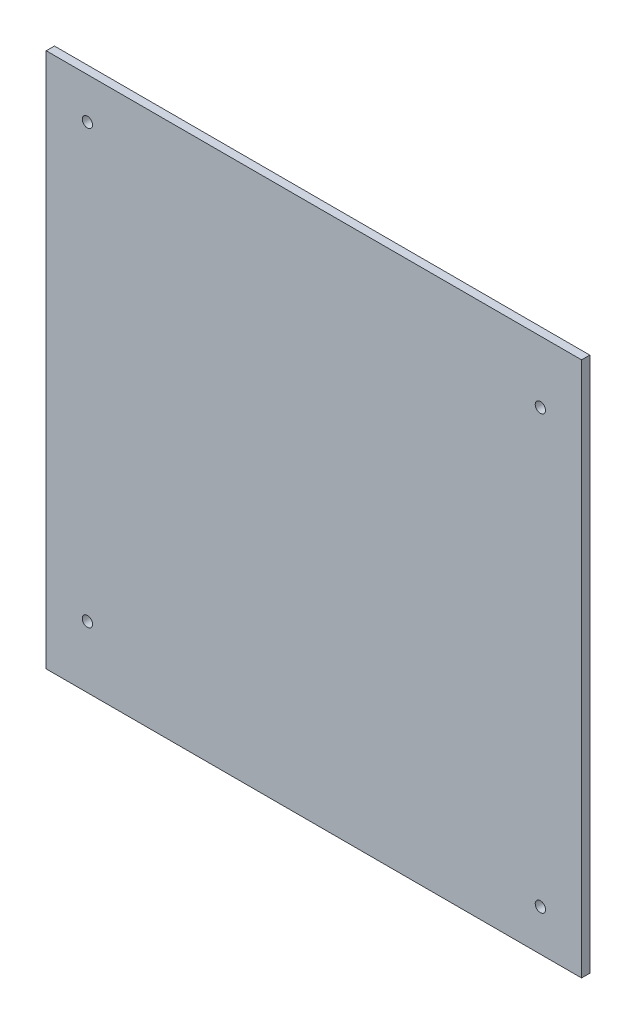
ISO-10303-21;
HEADER;
FILE_DESCRIPTION(('STEP AP214'),'2;1');
FILE_NAME('part.step','',(''),(''),'','','');
FILE_SCHEMA(('AUTOMOTIVE_DESIGN { 1 0 10303 214 1 1 1 1 }'));
ENDSEC;
DATA;
#1=APPLICATION_CONTEXT('core data for automotive mechanical design processes');
#2=APPLICATION_PROTOCOL_DEFINITION('international standard','automotive_design',2000,#1);
#3=PRODUCT_CONTEXT('',#1,'mechanical');
#4=PRODUCT('Part','Part','',(#3));
#5=PRODUCT_RELATED_PRODUCT_CATEGORY('part','',(#4));
#6=PRODUCT_DEFINITION_FORMATION('','',#4);
#7=PRODUCT_DEFINITION_CONTEXT('part definition',#1,'design');
#8=PRODUCT_DEFINITION('design','',#6,#7);
#9=PRODUCT_DEFINITION_SHAPE('','',#8);
#10=(LENGTH_UNIT() NAMED_UNIT(*) SI_UNIT(.MILLI.,.METRE.));
#11=(NAMED_UNIT(*) PLANE_ANGLE_UNIT() SI_UNIT($,.RADIAN.));
#12=(NAMED_UNIT(*) SI_UNIT($,.STERADIAN.) SOLID_ANGLE_UNIT());
#13=UNCERTAINTY_MEASURE_WITH_UNIT(LENGTH_MEASURE(1.E-05),#10,'distance_accuracy_value','');
#14=(GEOMETRIC_REPRESENTATION_CONTEXT(3) GLOBAL_UNCERTAINTY_ASSIGNED_CONTEXT((#13)) GLOBAL_UNIT_ASSIGNED_CONTEXT((#10,
#11,#12)) REPRESENTATION_CONTEXT('',''));
#15=CARTESIAN_POINT('',(0.,0.,0.));
#16=DIRECTION('',(0.,0.,1.));
#17=DIRECTION('',(1.,0.,0.));
#18=AXIS2_PLACEMENT_3D('',#15,#16,#17);
#19=CARTESIAN_POINT('',(0.,0.,2.));
#20=DIRECTION('',(0.,0.,-1.));
#21=DIRECTION('',(-1.,0.,0.));
#22=AXIS2_PLACEMENT_3D('',#19,#20,#21);
#23=PLANE('',#22);
#24=DIRECTION('',(0.,1.,0.));
#25=VECTOR('',#24,1.);
#26=CARTESIAN_POINT('',(65.,-65.,2.));
#27=LINE('',#26,#25);
#28=CARTESIAN_POINT('',(65.,-65.,2.));
#29=VERTEX_POINT('',#28);
#30=CARTESIAN_POINT('',(65.,65.,2.));
#31=VERTEX_POINT('',#30);
#32=EDGE_CURVE('E86',#29,#31,#27,.T.);
#33=ORIENTED_EDGE('',*,*,#32,.T.);
#34=DIRECTION('',(-1.,0.,0.));
#35=VECTOR('',#34,1.);
#36=CARTESIAN_POINT('',(-65.,65.,2.));
#37=LINE('',#36,#35);
#38=CARTESIAN_POINT('',(-65.,65.,2.));
#39=VERTEX_POINT('',#38);
#40=EDGE_CURVE('E81',#31,#39,#37,.T.);
#41=ORIENTED_EDGE('',*,*,#40,.T.);
#42=DIRECTION('',(0.,-1.,0.));
#43=VECTOR('',#42,1.);
#44=CARTESIAN_POINT('',(-65.,-65.,2.));
#45=LINE('',#44,#43);
#46=CARTESIAN_POINT('',(-65.,-65.,2.));
#47=VERTEX_POINT('',#46);
#48=EDGE_CURVE('E84',#39,#47,#45,.T.);
#49=ORIENTED_EDGE('',*,*,#48,.T.);
#50=DIRECTION('',(1.,0.,0.));
#51=VECTOR('',#50,1.);
#52=CARTESIAN_POINT('',(-65.,-65.,2.));
#53=LINE('',#52,#51);
#54=EDGE_CURVE('E51',#47,#29,#53,.T.);
#55=ORIENTED_EDGE('',*,*,#54,.T.);
#56=EDGE_LOOP('',(#33,#41,#49,#55));
#57=FACE_BOUND('',#56,.T.);
#58=CARTESIAN_POINT('',(-55.,55.,2.));
#59=DIRECTION('',(0.,0.,1.));
#60=DIRECTION('',(1.,0.,0.));
#61=AXIS2_PLACEMENT_3D('',#58,#59,#60);
#62=CIRCLE('',#61,1.25);
#63=CARTESIAN_POINT('',(-53.75,55.,2.));
#64=VERTEX_POINT('',#63);
#65=EDGE_CURVE('E101',#64,#64,#62,.T.);
#66=ORIENTED_EDGE('',*,*,#65,.F.);
#67=EDGE_LOOP('',(#66));
#68=FACE_BOUND('',#67,.T.);
#69=CARTESIAN_POINT('',(55.,50.,2.));
#70=DIRECTION('',(0.,0.,1.));
#71=DIRECTION('',(1.,0.,0.));
#72=AXIS2_PLACEMENT_3D('',#69,#70,#71);
#73=CIRCLE('',#72,1.25);
#74=CARTESIAN_POINT('',(56.25,50.,2.));
#75=VERTEX_POINT('',#74);
#76=EDGE_CURVE('E116',#75,#75,#73,.T.);
#77=ORIENTED_EDGE('',*,*,#76,.F.);
#78=EDGE_LOOP('',(#77));
#79=FACE_BOUND('',#78,.T.);
#80=CARTESIAN_POINT('',(55.,-55.,2.));
#81=DIRECTION('',(0.,0.,1.));
#82=DIRECTION('',(1.,0.,0.));
#83=AXIS2_PLACEMENT_3D('',#80,#81,#82);
#84=CIRCLE('',#83,1.25);
#85=CARTESIAN_POINT('',(56.25,-55.,2.));
#86=VERTEX_POINT('',#85);
#87=EDGE_CURVE('E122',#86,#86,#84,.T.);
#88=ORIENTED_EDGE('',*,*,#87,.F.);
#89=EDGE_LOOP('',(#88));
#90=FACE_BOUND('',#89,.T.);
#91=CARTESIAN_POINT('',(-55.,-50.,2.));
#92=DIRECTION('',(0.,0.,1.));
#93=DIRECTION('',(1.,0.,0.));
#94=AXIS2_PLACEMENT_3D('',#91,#92,#93);
#95=CIRCLE('',#94,1.25);
#96=CARTESIAN_POINT('',(-53.75,-50.,2.));
#97=VERTEX_POINT('',#96);
#98=EDGE_CURVE('E128',#97,#97,#95,.T.);
#99=ORIENTED_EDGE('',*,*,#98,.F.);
#100=EDGE_LOOP('',(#99));
#101=FACE_BOUND('',#100,.T.);
#102=ADVANCED_FACE('F34',(#57,#68,#79,#90,#101),#23,.F.);
#103=CARTESIAN_POINT('',(0.,0.,0.));
#104=DIRECTION('',(0.,0.,-1.));
#105=DIRECTION('',(-1.,0.,0.));
#106=AXIS2_PLACEMENT_3D('',#103,#104,#105);
#107=PLANE('',#106);
#108=CARTESIAN_POINT('',(55.,-55.,0.));
#109=DIRECTION('',(0.,0.,1.));
#110=DIRECTION('',(1.,0.,0.));
#111=AXIS2_PLACEMENT_3D('',#108,#109,#110);
#112=CIRCLE('',#111,1.25);
#113=CARTESIAN_POINT('',(56.25,-55.,0.));
#114=VERTEX_POINT('',#113);
#115=EDGE_CURVE('E125',#114,#114,#112,.T.);
#116=ORIENTED_EDGE('',*,*,#115,.T.);
#117=EDGE_LOOP('',(#116));
#118=FACE_BOUND('',#117,.T.);
#119=CARTESIAN_POINT('',(-55.,55.,0.));
#120=DIRECTION('',(0.,0.,1.));
#121=DIRECTION('',(1.,0.,0.));
#122=AXIS2_PLACEMENT_3D('',#119,#120,#121);
#123=CIRCLE('',#122,1.25);
#124=CARTESIAN_POINT('',(-53.75,55.,0.));
#125=VERTEX_POINT('',#124);
#126=EDGE_CURVE('E113',#125,#125,#123,.T.);
#127=ORIENTED_EDGE('',*,*,#126,.T.);
#128=EDGE_LOOP('',(#127));
#129=FACE_BOUND('',#128,.T.);
#130=DIRECTION('',(0.,1.,0.));
#131=VECTOR('',#130,1.);
#132=CARTESIAN_POINT('',(65.,-65.,0.));
#133=LINE('',#132,#131);
#134=CARTESIAN_POINT('',(65.,-65.,0.));
#135=VERTEX_POINT('',#134);
#136=CARTESIAN_POINT('',(65.,65.,0.));
#137=VERTEX_POINT('',#136);
#138=EDGE_CURVE('E98',#135,#137,#133,.T.);
#139=ORIENTED_EDGE('',*,*,#138,.F.);
#140=DIRECTION('',(1.,0.,0.));
#141=VECTOR('',#140,1.);
#142=CARTESIAN_POINT('',(-65.,-65.,0.));
#143=LINE('',#142,#141);
#144=CARTESIAN_POINT('',(-65.,-65.,0.));
#145=VERTEX_POINT('',#144);
#146=EDGE_CURVE('E74',#145,#135,#143,.T.);
#147=ORIENTED_EDGE('',*,*,#146,.F.);
#148=DIRECTION('',(0.,-1.,0.));
#149=VECTOR('',#148,1.);
#150=CARTESIAN_POINT('',(-65.,-65.,0.));
#151=LINE('',#150,#149);
#152=CARTESIAN_POINT('',(-65.,65.,0.));
#153=VERTEX_POINT('',#152);
#154=EDGE_CURVE('E68',#153,#145,#151,.T.);
#155=ORIENTED_EDGE('',*,*,#154,.F.);
#156=DIRECTION('',(-1.,0.,0.));
#157=VECTOR('',#156,1.);
#158=CARTESIAN_POINT('',(-65.,65.,0.));
#159=LINE('',#158,#157);
#160=EDGE_CURVE('E90',#137,#153,#159,.T.);
#161=ORIENTED_EDGE('',*,*,#160,.F.);
#162=EDGE_LOOP('',(#139,#147,#155,#161));
#163=FACE_BOUND('',#162,.T.);
#164=CARTESIAN_POINT('',(55.,50.,0.));
#165=DIRECTION('',(0.,0.,1.));
#166=DIRECTION('',(1.,0.,0.));
#167=AXIS2_PLACEMENT_3D('',#164,#165,#166);
#168=CIRCLE('',#167,1.25);
#169=CARTESIAN_POINT('',(56.25,50.,0.));
#170=VERTEX_POINT('',#169);
#171=EDGE_CURVE('E119',#170,#170,#168,.T.);
#172=ORIENTED_EDGE('',*,*,#171,.T.);
#173=EDGE_LOOP('',(#172));
#174=FACE_BOUND('',#173,.T.);
#175=CARTESIAN_POINT('',(-55.,-50.,0.));
#176=DIRECTION('',(0.,0.,1.));
#177=DIRECTION('',(1.,0.,0.));
#178=AXIS2_PLACEMENT_3D('',#175,#176,#177);
#179=CIRCLE('',#178,1.25);
#180=CARTESIAN_POINT('',(-53.75,-50.,0.));
#181=VERTEX_POINT('',#180);
#182=EDGE_CURVE('E131',#181,#181,#179,.T.);
#183=ORIENTED_EDGE('',*,*,#182,.T.);
#184=EDGE_LOOP('',(#183));
#185=FACE_BOUND('',#184,.T.);
#186=ADVANCED_FACE('F109',(#118,#129,#163,#174,#185),#107,.T.);
#187=CARTESIAN_POINT('',(65.,-65.,2.));
#188=DIRECTION('',(-1.,0.,0.));
#189=DIRECTION('',(0.,0.,1.));
#190=AXIS2_PLACEMENT_3D('',#187,#188,#189);
#191=PLANE('',#190);
#192=ORIENTED_EDGE('',*,*,#138,.T.);
#193=DIRECTION('',(0.,0.,-1.));
#194=VECTOR('',#193,1.);
#195=CARTESIAN_POINT('',(65.,65.,2.));
#196=LINE('',#195,#194);
#197=EDGE_CURVE('E11',#31,#137,#196,.T.);
#198=ORIENTED_EDGE('',*,*,#197,.F.);
#199=ORIENTED_EDGE('',*,*,#32,.F.);
#200=DIRECTION('',(0.,0.,-1.));
#201=VECTOR('',#200,1.);
#202=CARTESIAN_POINT('',(65.,-65.,2.));
#203=LINE('',#202,#201);
#204=EDGE_CURVE('E94',#29,#135,#203,.T.);
#205=ORIENTED_EDGE('',*,*,#204,.T.);
#206=EDGE_LOOP('',(#192,#198,#199,#205));
#207=FACE_BOUND('',#206,.T.);
#208=ADVANCED_FACE('F36',(#207),#191,.F.);
#209=CARTESIAN_POINT('',(-65.,65.,2.));
#210=DIRECTION('',(0.,-1.,0.));
#211=DIRECTION('',(0.,0.,-1.));
#212=AXIS2_PLACEMENT_3D('',#209,#210,#211);
#213=PLANE('',#212);
#214=ORIENTED_EDGE('',*,*,#160,.T.);
#215=DIRECTION('',(0.,0.,-1.));
#216=VECTOR('',#215,1.);
#217=CARTESIAN_POINT('',(-65.,65.,2.));
#218=LINE('',#217,#216);
#219=EDGE_CURVE('E43',#39,#153,#218,.T.);
#220=ORIENTED_EDGE('',*,*,#219,.F.);
#221=ORIENTED_EDGE('',*,*,#40,.F.);
#222=ORIENTED_EDGE('',*,*,#197,.T.);
#223=EDGE_LOOP('',(#214,#220,#221,#222));
#224=FACE_BOUND('',#223,.T.);
#225=ADVANCED_FACE('F89',(#224),#213,.F.);
#226=CARTESIAN_POINT('',(-65.,-65.,2.));
#227=DIRECTION('',(1.,0.,0.));
#228=DIRECTION('',(0.,0.,-1.));
#229=AXIS2_PLACEMENT_3D('',#226,#227,#228);
#230=PLANE('',#229);
#231=ORIENTED_EDGE('',*,*,#154,.T.);
#232=DIRECTION('',(0.,0.,-1.));
#233=VECTOR('',#232,1.);
#234=CARTESIAN_POINT('',(-65.,-65.,2.));
#235=LINE('',#234,#233);
#236=EDGE_CURVE('E91',#47,#145,#235,.T.);
#237=ORIENTED_EDGE('',*,*,#236,.F.);
#238=ORIENTED_EDGE('',*,*,#48,.F.);
#239=ORIENTED_EDGE('',*,*,#219,.T.);
#240=EDGE_LOOP('',(#231,#237,#238,#239));
#241=FACE_BOUND('',#240,.T.);
#242=ADVANCED_FACE('F92',(#241),#230,.F.);
#243=CARTESIAN_POINT('',(-65.,-65.,2.));
#244=DIRECTION('',(0.,1.,0.));
#245=DIRECTION('',(0.,0.,1.));
#246=AXIS2_PLACEMENT_3D('',#243,#244,#245);
#247=PLANE('',#246);
#248=ORIENTED_EDGE('',*,*,#146,.T.);
#249=ORIENTED_EDGE('',*,*,#204,.F.);
#250=ORIENTED_EDGE('',*,*,#54,.F.);
#251=ORIENTED_EDGE('',*,*,#236,.T.);
#252=EDGE_LOOP('',(#248,#249,#250,#251));
#253=FACE_BOUND('',#252,.T.);
#254=ADVANCED_FACE('F106',(#253),#247,.F.);
#255=CARTESIAN_POINT('',(-55.,55.,2.));
#256=DIRECTION('',(0.,0.,-1.));
#257=DIRECTION('',(-1.,0.,0.));
#258=AXIS2_PLACEMENT_3D('',#255,#256,#257);
#259=CYLINDRICAL_SURFACE('',#258,1.25);
#260=ORIENTED_EDGE('',*,*,#65,.T.);
#261=EDGE_LOOP('',(#260));
#262=FACE_BOUND('',#261,.T.);
#263=ORIENTED_EDGE('',*,*,#126,.F.);
#264=EDGE_LOOP('',(#263));
#265=FACE_BOUND('',#264,.T.);
#266=ADVANCED_FACE('F148',(#262,#265),#259,.F.);
#267=CARTESIAN_POINT('',(55.,50.,2.));
#268=DIRECTION('',(0.,0.,-1.));
#269=DIRECTION('',(-1.,0.,0.));
#270=AXIS2_PLACEMENT_3D('',#267,#268,#269);
#271=CYLINDRICAL_SURFACE('',#270,1.25);
#272=ORIENTED_EDGE('',*,*,#76,.T.);
#273=EDGE_LOOP('',(#272));
#274=FACE_BOUND('',#273,.T.);
#275=ORIENTED_EDGE('',*,*,#171,.F.);
#276=EDGE_LOOP('',(#275));
#277=FACE_BOUND('',#276,.T.);
#278=ADVANCED_FACE('F194',(#274,#277),#271,.F.);
#279=CARTESIAN_POINT('',(55.,-55.,2.));
#280=DIRECTION('',(0.,0.,-1.));
#281=DIRECTION('',(-1.,0.,0.));
#282=AXIS2_PLACEMENT_3D('',#279,#280,#281);
#283=CYLINDRICAL_SURFACE('',#282,1.25);
#284=ORIENTED_EDGE('',*,*,#87,.T.);
#285=EDGE_LOOP('',(#284));
#286=FACE_BOUND('',#285,.T.);
#287=ORIENTED_EDGE('',*,*,#115,.F.);
#288=EDGE_LOOP('',(#287));
#289=FACE_BOUND('',#288,.T.);
#290=ADVANCED_FACE('F202',(#286,#289),#283,.F.);
#291=CARTESIAN_POINT('',(-55.,-50.,2.));
#292=DIRECTION('',(0.,0.,-1.));
#293=DIRECTION('',(-1.,0.,0.));
#294=AXIS2_PLACEMENT_3D('',#291,#292,#293);
#295=CYLINDRICAL_SURFACE('',#294,1.25);
#296=ORIENTED_EDGE('',*,*,#98,.T.);
#297=EDGE_LOOP('',(#296));
#298=FACE_BOUND('',#297,.T.);
#299=ORIENTED_EDGE('',*,*,#182,.F.);
#300=EDGE_LOOP('',(#299));
#301=FACE_BOUND('',#300,.T.);
#302=ADVANCED_FACE('F137',(#298,#301),#295,.F.);
#303=CLOSED_SHELL('',(#102,#186,#208,#225,#242,#254,#266,#278,#290,#302));
#304=MANIFOLD_SOLID_BREP('B2',#303);
#305=ADVANCED_BREP_SHAPE_REPRESENTATION('',(#18,#304),#14);
#306=SHAPE_DEFINITION_REPRESENTATION(#9,#305);
ENDSEC;
END-ISO-10303-21;
